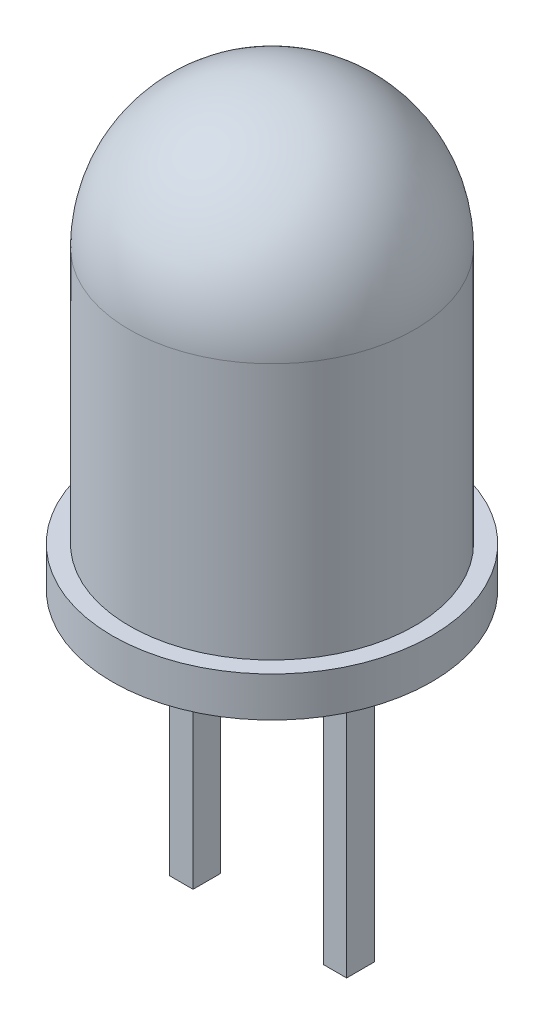
ISO-10303-21;
HEADER;
FILE_DESCRIPTION(('STEP AP214'),'2;1');
FILE_NAME('part.step','',(''),(''),'','','');
FILE_SCHEMA(('AUTOMOTIVE_DESIGN { 1 0 10303 214 1 1 1 1 }'));
ENDSEC;
DATA;
#1=APPLICATION_CONTEXT('core data for automotive mechanical design processes');
#2=APPLICATION_PROTOCOL_DEFINITION('international standard','automotive_design',2000,#1);
#3=PRODUCT_CONTEXT('',#1,'mechanical');
#4=PRODUCT('Part','Part','',(#3));
#5=PRODUCT_RELATED_PRODUCT_CATEGORY('part','',(#4));
#6=PRODUCT_DEFINITION_FORMATION('','',#4);
#7=PRODUCT_DEFINITION_CONTEXT('part definition',#1,'design');
#8=PRODUCT_DEFINITION('design','',#6,#7);
#9=PRODUCT_DEFINITION_SHAPE('','',#8);
#10=(LENGTH_UNIT() NAMED_UNIT(*) SI_UNIT(.MILLI.,.METRE.));
#11=(NAMED_UNIT(*) PLANE_ANGLE_UNIT() SI_UNIT($,.RADIAN.));
#12=(NAMED_UNIT(*) SI_UNIT($,.STERADIAN.) SOLID_ANGLE_UNIT());
#13=UNCERTAINTY_MEASURE_WITH_UNIT(LENGTH_MEASURE(1.E-05),#10,'distance_accuracy_value','');
#14=(GEOMETRIC_REPRESENTATION_CONTEXT(3) GLOBAL_UNCERTAINTY_ASSIGNED_CONTEXT((#13)) GLOBAL_UNIT_ASSIGNED_CONTEXT((#10,
#11,#12)) REPRESENTATION_CONTEXT('',''));
#15=CARTESIAN_POINT('',(0.,0.,0.));
#16=DIRECTION('',(0.,0.,1.));
#17=DIRECTION('',(1.,0.,0.));
#18=AXIS2_PLACEMENT_3D('',#15,#16,#17);
#19=CARTESIAN_POINT('',(0.,-0.7,0.));
#20=DIRECTION('',(0.,-1.,0.));
#21=DIRECTION('',(0.,0.,-1.));
#22=AXIS2_PLACEMENT_3D('',#19,#20,#21);
#23=PLANE('',#22);
#24=DIRECTION('',(-1.,0.,0.));
#25=VECTOR('',#24,1.);
#26=CARTESIAN_POINT('',(1.14190313671731,-0.7,0.242385099774928));
#27=LINE('',#26,#25);
#28=CARTESIAN_POINT('',(1.55126463855937,-0.7,0.242385099774928));
#29=VERTEX_POINT('',#28);
#30=CARTESIAN_POINT('',(1.14190313671731,-0.7,0.242385099774928));
#31=VERTEX_POINT('',#30);
#32=EDGE_CURVE('E129',#29,#31,#27,.T.);
#33=ORIENTED_EDGE('',*,*,#32,.F.);
#34=DIRECTION('',(0.,0.,1.));
#35=VECTOR('',#34,1.);
#36=CARTESIAN_POINT('',(1.55126463855937,-0.7,-0.242385099774928));
#37=LINE('',#36,#35);
#38=CARTESIAN_POINT('',(1.55126463855937,-0.7,-0.242385099774928));
#39=VERTEX_POINT('',#38);
#40=EDGE_CURVE('E126',#39,#29,#37,.T.);
#41=ORIENTED_EDGE('',*,*,#40,.F.);
#42=DIRECTION('',(1.,0.,0.));
#43=VECTOR('',#42,1.);
#44=CARTESIAN_POINT('',(1.14190313671731,-0.7,-0.242385099774928));
#45=LINE('',#44,#43);
#46=CARTESIAN_POINT('',(1.14190313671731,-0.7,-0.242385099774928));
#47=VERTEX_POINT('',#46);
#48=EDGE_CURVE('E138',#47,#39,#45,.T.);
#49=ORIENTED_EDGE('',*,*,#48,.F.);
#50=DIRECTION('',(0.,0.,-1.));
#51=VECTOR('',#50,1.);
#52=CARTESIAN_POINT('',(1.14190313671731,-0.7,-0.242385099774928));
#53=LINE('',#52,#51);
#54=EDGE_CURVE('E146',#31,#47,#53,.T.);
#55=ORIENTED_EDGE('',*,*,#54,.F.);
#56=EDGE_LOOP('',(#33,#41,#49,#55));
#57=FACE_BOUND('',#56,.T.);
#58=CARTESIAN_POINT('',(0.,-0.7,0.));
#59=DIRECTION('',(0.,-1.,0.));
#60=DIRECTION('',(0.,0.,-1.));
#61=AXIS2_PLACEMENT_3D('',#58,#59,#60);
#62=CIRCLE('',#61,2.8);
#63=CARTESIAN_POINT('',(0.,-0.7,-2.8));
#64=VERTEX_POINT('',#63);
#65=EDGE_CURVE('E158',#64,#64,#62,.T.);
#66=ORIENTED_EDGE('',*,*,#65,.T.);
#67=EDGE_LOOP('',(#66));
#68=FACE_BOUND('',#67,.T.);
#69=DIRECTION('',(-1.,0.,0.));
#70=VECTOR('',#69,1.);
#71=CARTESIAN_POINT('',(-1.14190313671731,-0.7,0.242385099774928));
#72=LINE('',#71,#70);
#73=CARTESIAN_POINT('',(-1.14190313671731,-0.7,0.242385099774928));
#74=VERTEX_POINT('',#73);
#75=CARTESIAN_POINT('',(-1.55126463855937,-0.7,0.242385099774928));
#76=VERTEX_POINT('',#75);
#77=EDGE_CURVE('E312',#74,#76,#72,.T.);
#78=ORIENTED_EDGE('',*,*,#77,.F.);
#79=DIRECTION('',(0.,0.,1.));
#80=VECTOR('',#79,1.);
#81=CARTESIAN_POINT('',(-1.14190313671731,-0.7,-0.242385099774928));
#82=LINE('',#81,#80);
#83=CARTESIAN_POINT('',(-1.14190313671731,-0.7,-0.242385099774928));
#84=VERTEX_POINT('',#83);
#85=EDGE_CURVE('E124',#84,#74,#82,.T.);
#86=ORIENTED_EDGE('',*,*,#85,.F.);
#87=DIRECTION('',(1.,0.,0.));
#88=VECTOR('',#87,1.);
#89=CARTESIAN_POINT('',(-1.14190313671731,-0.7,-0.242385099774928));
#90=LINE('',#89,#88);
#91=CARTESIAN_POINT('',(-1.55126463855937,-0.7,-0.242385099774928));
#92=VERTEX_POINT('',#91);
#93=EDGE_CURVE('E120',#92,#84,#90,.T.);
#94=ORIENTED_EDGE('',*,*,#93,.F.);
#95=DIRECTION('',(0.,0.,-1.));
#96=VECTOR('',#95,1.);
#97=CARTESIAN_POINT('',(-1.55126463855937,-0.7,-0.242385099774928));
#98=LINE('',#97,#96);
#99=EDGE_CURVE('E309',#76,#92,#98,.T.);
#100=ORIENTED_EDGE('',*,*,#99,.F.);
#101=EDGE_LOOP('',(#78,#86,#94,#100));
#102=FACE_BOUND('',#101,.T.);
#103=ADVANCED_FACE('F35',(#57,#68,#102),#23,.T.);
#104=CARTESIAN_POINT('',(0.,7.,0.));
#105=DIRECTION('',(0.,-1.,0.));
#106=DIRECTION('',(0.,0.,-1.));
#107=AXIS2_PLACEMENT_3D('',#104,#105,#106);
#108=CYLINDRICAL_SURFACE('',#107,2.5);
#109=CARTESIAN_POINT('',(0.,4.5,0.));
#110=DIRECTION('',(0.,-1.,0.));
#111=DIRECTION('',(0.,0.,-1.));
#112=AXIS2_PLACEMENT_3D('',#109,#110,#111);
#113=CIRCLE('',#112,2.5);
#114=CARTESIAN_POINT('',(0.,4.5,-2.5));
#115=VERTEX_POINT('',#114);
#116=EDGE_CURVE('E11',#115,#115,#113,.T.);
#117=ORIENTED_EDGE('',*,*,#116,.T.);
#118=EDGE_LOOP('',(#117));
#119=FACE_BOUND('',#118,.T.);
#120=CARTESIAN_POINT('',(0.,0.,0.));
#121=DIRECTION('',(0.,-1.,0.));
#122=DIRECTION('',(0.,0.,-1.));
#123=AXIS2_PLACEMENT_3D('',#120,#121,#122);
#124=CIRCLE('',#123,2.5);
#125=CARTESIAN_POINT('',(0.,0.,-2.5));
#126=VERTEX_POINT('',#125);
#127=EDGE_CURVE('E43',#126,#126,#124,.T.);
#128=ORIENTED_EDGE('',*,*,#127,.F.);
#129=EDGE_LOOP('',(#128));
#130=FACE_BOUND('',#129,.T.);
#131=ADVANCED_FACE('F167',(#119,#130),#108,.T.);
#132=CARTESIAN_POINT('',(0.,0.,0.));
#133=DIRECTION('',(0.,-1.,0.));
#134=DIRECTION('',(0.,0.,-1.));
#135=AXIS2_PLACEMENT_3D('',#132,#133,#134);
#136=PLANE('',#135);
#137=CARTESIAN_POINT('',(0.,0.,0.));
#138=DIRECTION('',(0.,-1.,0.));
#139=DIRECTION('',(0.,0.,-1.));
#140=AXIS2_PLACEMENT_3D('',#137,#138,#139);
#141=CIRCLE('',#140,2.8);
#142=CARTESIAN_POINT('',(0.,0.,-2.8));
#143=VERTEX_POINT('',#142);
#144=EDGE_CURVE('E157',#143,#143,#141,.T.);
#145=ORIENTED_EDGE('',*,*,#144,.F.);
#146=EDGE_LOOP('',(#145));
#147=FACE_BOUND('',#146,.T.);
#148=ORIENTED_EDGE('',*,*,#127,.T.);
#149=EDGE_LOOP('',(#148));
#150=FACE_BOUND('',#149,.T.);
#151=ADVANCED_FACE('F165',(#147,#150),#136,.F.);
#152=CARTESIAN_POINT('',(0.,-0.7,0.));
#153=DIRECTION('',(0.,1.,0.));
#154=DIRECTION('',(0.,0.,1.));
#155=AXIS2_PLACEMENT_3D('',#152,#153,#154);
#156=CYLINDRICAL_SURFACE('',#155,2.8);
#157=ORIENTED_EDGE('',*,*,#65,.F.);
#158=EDGE_LOOP('',(#157));
#159=FACE_BOUND('',#158,.T.);
#160=ORIENTED_EDGE('',*,*,#144,.T.);
#161=EDGE_LOOP('',(#160));
#162=FACE_BOUND('',#161,.T.);
#163=ADVANCED_FACE('F174',(#159,#162),#156,.T.);
#164=CARTESIAN_POINT('',(0.,4.5,0.));
#165=DIRECTION('',(0.,0.,1.));
#166=DIRECTION('',(1.,0.,0.));
#167=AXIS2_PLACEMENT_3D('',#164,#165,#166);
#168=SPHERICAL_SURFACE('',#167,2.5);
#169=CARTESIAN_POINT('',(0.,4.5,0.));
#170=DIRECTION('',(0.,-1.,0.));
#171=DIRECTION('',(0.,0.,-1.));
#172=AXIS2_PLACEMENT_3D('',#169,#170,#171);
#173=SPHERICAL_SURFACE('',#172,2.5);
#174=ORIENTED_EDGE('',*,*,#116,.F.);
#175=EDGE_LOOP('',(#174));
#176=FACE_BOUND('',#175,.T.);
#177=ADVANCED_FACE('F37',(#176),#173,.T.);
#178=CARTESIAN_POINT('',(1.55126463855937,-5.7,-0.242385099774928));
#179=DIRECTION('',(-1.,0.,0.));
#180=DIRECTION('',(0.,0.,1.));
#181=AXIS2_PLACEMENT_3D('',#178,#179,#180);
#182=PLANE('',#181);
#183=ORIENTED_EDGE('',*,*,#40,.T.);
#184=DIRECTION('',(0.,1.,0.));
#185=VECTOR('',#184,1.);
#186=CARTESIAN_POINT('',(1.55126463855937,-5.7,0.242385099774928));
#187=LINE('',#186,#185);
#188=CARTESIAN_POINT('',(1.55126463855937,-5.7,0.242385099774928));
#189=VERTEX_POINT('',#188);
#190=EDGE_CURVE('E155',#189,#29,#187,.T.);
#191=ORIENTED_EDGE('',*,*,#190,.F.);
#192=DIRECTION('',(0.,0.,1.));
#193=VECTOR('',#192,1.);
#194=CARTESIAN_POINT('',(1.55126463855937,-5.7,-0.242385099774928));
#195=LINE('',#194,#193);
#196=CARTESIAN_POINT('',(1.55126463855937,-5.7,-0.242385099774928));
#197=VERTEX_POINT('',#196);
#198=EDGE_CURVE('E134',#197,#189,#195,.T.);
#199=ORIENTED_EDGE('',*,*,#198,.F.);
#200=DIRECTION('',(0.,1.,0.));
#201=VECTOR('',#200,1.);
#202=CARTESIAN_POINT('',(1.55126463855937,-5.7,-0.242385099774928));
#203=LINE('',#202,#201);
#204=EDGE_CURVE('E143',#197,#39,#203,.T.);
#205=ORIENTED_EDGE('',*,*,#204,.T.);
#206=EDGE_LOOP('',(#183,#191,#199,#205));
#207=FACE_BOUND('',#206,.T.);
#208=ADVANCED_FACE('F183',(#207),#182,.F.);
#209=CARTESIAN_POINT('',(1.14190313671731,-5.7,0.242385099774928));
#210=DIRECTION('',(0.,0.,-1.));
#211=DIRECTION('',(-1.,0.,0.));
#212=AXIS2_PLACEMENT_3D('',#209,#210,#211);
#213=PLANE('',#212);
#214=ORIENTED_EDGE('',*,*,#32,.T.);
#215=DIRECTION('',(0.,1.,0.));
#216=VECTOR('',#215,1.);
#217=CARTESIAN_POINT('',(1.14190313671731,-5.7,0.242385099774928));
#218=LINE('',#217,#216);
#219=CARTESIAN_POINT('',(1.14190313671731,-5.7,0.242385099774928));
#220=VERTEX_POINT('',#219);
#221=EDGE_CURVE('E152',#220,#31,#218,.T.);
#222=ORIENTED_EDGE('',*,*,#221,.F.);
#223=DIRECTION('',(-1.,0.,0.));
#224=VECTOR('',#223,1.);
#225=CARTESIAN_POINT('',(1.14190313671731,-5.7,0.242385099774928));
#226=LINE('',#225,#224);
#227=EDGE_CURVE('E137',#189,#220,#226,.T.);
#228=ORIENTED_EDGE('',*,*,#227,.F.);
#229=ORIENTED_EDGE('',*,*,#190,.T.);
#230=EDGE_LOOP('',(#214,#222,#228,#229));
#231=FACE_BOUND('',#230,.T.);
#232=ADVANCED_FACE('F186',(#231),#213,.F.);
#233=CARTESIAN_POINT('',(1.14190313671731,-5.7,-0.242385099774928));
#234=DIRECTION('',(1.,0.,0.));
#235=DIRECTION('',(0.,0.,-1.));
#236=AXIS2_PLACEMENT_3D('',#233,#234,#235);
#237=PLANE('',#236);
#238=ORIENTED_EDGE('',*,*,#54,.T.);
#239=DIRECTION('',(0.,1.,0.));
#240=VECTOR('',#239,1.);
#241=CARTESIAN_POINT('',(1.14190313671731,-5.7,-0.242385099774928));
#242=LINE('',#241,#240);
#243=CARTESIAN_POINT('',(1.14190313671731,-5.7,-0.242385099774928));
#244=VERTEX_POINT('',#243);
#245=EDGE_CURVE('E58',#244,#47,#242,.T.);
#246=ORIENTED_EDGE('',*,*,#245,.F.);
#247=DIRECTION('',(0.,0.,-1.));
#248=VECTOR('',#247,1.);
#249=CARTESIAN_POINT('',(1.14190313671731,-5.7,-0.242385099774928));
#250=LINE('',#249,#248);
#251=EDGE_CURVE('E140',#220,#244,#250,.T.);
#252=ORIENTED_EDGE('',*,*,#251,.F.);
#253=ORIENTED_EDGE('',*,*,#221,.T.);
#254=EDGE_LOOP('',(#238,#246,#252,#253));
#255=FACE_BOUND('',#254,.T.);
#256=ADVANCED_FACE('F190',(#255),#237,.F.);
#257=CARTESIAN_POINT('',(1.14190313671731,-5.7,-0.242385099774928));
#258=DIRECTION('',(0.,0.,1.));
#259=DIRECTION('',(1.,0.,0.));
#260=AXIS2_PLACEMENT_3D('',#257,#258,#259);
#261=PLANE('',#260);
#262=ORIENTED_EDGE('',*,*,#48,.T.);
#263=ORIENTED_EDGE('',*,*,#204,.F.);
#264=DIRECTION('',(1.,0.,0.));
#265=VECTOR('',#264,1.);
#266=CARTESIAN_POINT('',(1.14190313671731,-5.7,-0.242385099774928));
#267=LINE('',#266,#265);
#268=EDGE_CURVE('E142',#244,#197,#267,.T.);
#269=ORIENTED_EDGE('',*,*,#268,.F.);
#270=ORIENTED_EDGE('',*,*,#245,.T.);
#271=EDGE_LOOP('',(#262,#263,#269,#270));
#272=FACE_BOUND('',#271,.T.);
#273=ADVANCED_FACE('F194',(#272),#261,.F.);
#274=CARTESIAN_POINT('',(1.55126463855937,-5.7,0.242385099774928));
#275=DIRECTION('',(0.,1.,0.));
#276=DIRECTION('',(0.,0.,1.));
#277=AXIS2_PLACEMENT_3D('',#274,#275,#276);
#278=PLANE('',#277);
#279=ORIENTED_EDGE('',*,*,#198,.T.);
#280=ORIENTED_EDGE('',*,*,#227,.T.);
#281=ORIENTED_EDGE('',*,*,#251,.T.);
#282=ORIENTED_EDGE('',*,*,#268,.T.);
#283=EDGE_LOOP('',(#279,#280,#281,#282));
#284=FACE_BOUND('',#283,.T.);
#285=ADVANCED_FACE('F198',(#284),#278,.F.);
#286=CARTESIAN_POINT('',(-1.14190313671731,-5.7,-0.242385099774928));
#287=DIRECTION('',(-1.,0.,0.));
#288=DIRECTION('',(0.,0.,1.));
#289=AXIS2_PLACEMENT_3D('',#286,#287,#288);
#290=PLANE('',#289);
#291=ORIENTED_EDGE('',*,*,#85,.T.);
#292=DIRECTION('',(0.,1.,0.));
#293=VECTOR('',#292,1.);
#294=CARTESIAN_POINT('',(-1.14190313671731,-5.7,0.242385099774928));
#295=LINE('',#294,#293);
#296=CARTESIAN_POINT('',(-1.14190313671731,-5.7,0.242385099774928));
#297=VERTEX_POINT('',#296);
#298=EDGE_CURVE('E105',#297,#74,#295,.T.);
#299=ORIENTED_EDGE('',*,*,#298,.F.);
#300=DIRECTION('',(0.,0.,1.));
#301=VECTOR('',#300,1.);
#302=CARTESIAN_POINT('',(-1.14190313671731,-5.7,-0.242385099774928));
#303=LINE('',#302,#301);
#304=CARTESIAN_POINT('',(-1.14190313671731,-5.7,-0.242385099774928));
#305=VERTEX_POINT('',#304);
#306=EDGE_CURVE('E112',#305,#297,#303,.T.);
#307=ORIENTED_EDGE('',*,*,#306,.F.);
#308=DIRECTION('',(0.,1.,0.));
#309=VECTOR('',#308,1.);
#310=CARTESIAN_POINT('',(-1.14190313671731,-5.7,-0.242385099774928));
#311=LINE('',#310,#309);
#312=EDGE_CURVE('E306',#305,#84,#311,.T.);
#313=ORIENTED_EDGE('',*,*,#312,.T.);
#314=EDGE_LOOP('',(#291,#299,#307,#313));
#315=FACE_BOUND('',#314,.T.);
#316=ADVANCED_FACE('F122',(#315),#290,.F.);
#317=CARTESIAN_POINT('',(-1.14190313671731,-5.7,0.242385099774928));
#318=DIRECTION('',(0.,0.,-1.));
#319=DIRECTION('',(-1.,0.,0.));
#320=AXIS2_PLACEMENT_3D('',#317,#318,#319);
#321=PLANE('',#320);
#322=ORIENTED_EDGE('',*,*,#77,.T.);
#323=DIRECTION('',(0.,1.,0.));
#324=VECTOR('',#323,1.);
#325=CARTESIAN_POINT('',(-1.55126463855937,-5.7,0.242385099774928));
#326=LINE('',#325,#324);
#327=CARTESIAN_POINT('',(-1.55126463855937,-5.7,0.242385099774928));
#328=VERTEX_POINT('',#327);
#329=EDGE_CURVE('E108',#328,#76,#326,.T.);
#330=ORIENTED_EDGE('',*,*,#329,.F.);
#331=DIRECTION('',(-1.,0.,0.));
#332=VECTOR('',#331,1.);
#333=CARTESIAN_POINT('',(-1.14190313671731,-5.7,0.242385099774928));
#334=LINE('',#333,#332);
#335=EDGE_CURVE('E101',#297,#328,#334,.T.);
#336=ORIENTED_EDGE('',*,*,#335,.F.);
#337=ORIENTED_EDGE('',*,*,#298,.T.);
#338=EDGE_LOOP('',(#322,#330,#336,#337));
#339=FACE_BOUND('',#338,.T.);
#340=ADVANCED_FACE('F103',(#339),#321,.F.);
#341=CARTESIAN_POINT('',(-1.55126463855937,-5.7,-0.242385099774928));
#342=DIRECTION('',(1.,0.,0.));
#343=DIRECTION('',(0.,0.,-1.));
#344=AXIS2_PLACEMENT_3D('',#341,#342,#343);
#345=PLANE('',#344);
#346=ORIENTED_EDGE('',*,*,#99,.T.);
#347=DIRECTION('',(0.,1.,0.));
#348=VECTOR('',#347,1.);
#349=CARTESIAN_POINT('',(-1.55126463855937,-5.7,-0.242385099774928));
#350=LINE('',#349,#348);
#351=CARTESIAN_POINT('',(-1.55126463855937,-5.7,-0.242385099774928));
#352=VERTEX_POINT('',#351);
#353=EDGE_CURVE('E50',#352,#92,#350,.T.);
#354=ORIENTED_EDGE('',*,*,#353,.F.);
#355=DIRECTION('',(0.,0.,-1.));
#356=VECTOR('',#355,1.);
#357=CARTESIAN_POINT('',(-1.55126463855937,-5.7,-0.242385099774928));
#358=LINE('',#357,#356);
#359=EDGE_CURVE('E111',#328,#352,#358,.T.);
#360=ORIENTED_EDGE('',*,*,#359,.F.);
#361=ORIENTED_EDGE('',*,*,#329,.T.);
#362=EDGE_LOOP('',(#346,#354,#360,#361));
#363=FACE_BOUND('',#362,.T.);
#364=ADVANCED_FACE('F206',(#363),#345,.F.);
#365=CARTESIAN_POINT('',(-1.14190313671731,-5.7,-0.242385099774928));
#366=DIRECTION('',(0.,0.,1.));
#367=DIRECTION('',(1.,0.,0.));
#368=AXIS2_PLACEMENT_3D('',#365,#366,#367);
#369=PLANE('',#368);
#370=ORIENTED_EDGE('',*,*,#93,.T.);
#371=ORIENTED_EDGE('',*,*,#312,.F.);
#372=DIRECTION('',(1.,0.,0.));
#373=VECTOR('',#372,1.);
#374=CARTESIAN_POINT('',(-1.14190313671731,-5.7,-0.242385099774928));
#375=LINE('',#374,#373);
#376=EDGE_CURVE('E116',#352,#305,#375,.T.);
#377=ORIENTED_EDGE('',*,*,#376,.F.);
#378=ORIENTED_EDGE('',*,*,#353,.T.);
#379=EDGE_LOOP('',(#370,#371,#377,#378));
#380=FACE_BOUND('',#379,.T.);
#381=ADVANCED_FACE('F209',(#380),#369,.F.);
#382=CARTESIAN_POINT('',(-1.14190313671731,-5.7,0.242385099774928));
#383=DIRECTION('',(0.,-1.,0.));
#384=DIRECTION('',(0.,0.,-1.));
#385=AXIS2_PLACEMENT_3D('',#382,#383,#384);
#386=PLANE('',#385);
#387=ORIENTED_EDGE('',*,*,#306,.T.);
#388=ORIENTED_EDGE('',*,*,#335,.T.);
#389=ORIENTED_EDGE('',*,*,#359,.T.);
#390=ORIENTED_EDGE('',*,*,#376,.T.);
#391=EDGE_LOOP('',(#387,#388,#389,#390));
#392=FACE_BOUND('',#391,.T.);
#393=ADVANCED_FACE('F115',(#392),#386,.T.);
#394=CLOSED_SHELL('',(#103,#131,#151,#163,#177,#208,#232,#256,#273,#285,#316,#340,#364,#381,#393));
#395=MANIFOLD_SOLID_BREP('B2',#394);
#396=ADVANCED_BREP_SHAPE_REPRESENTATION('',(#18,#395),#14);
#397=SHAPE_DEFINITION_REPRESENTATION(#9,#396);
ENDSEC;
END-ISO-10303-21;
